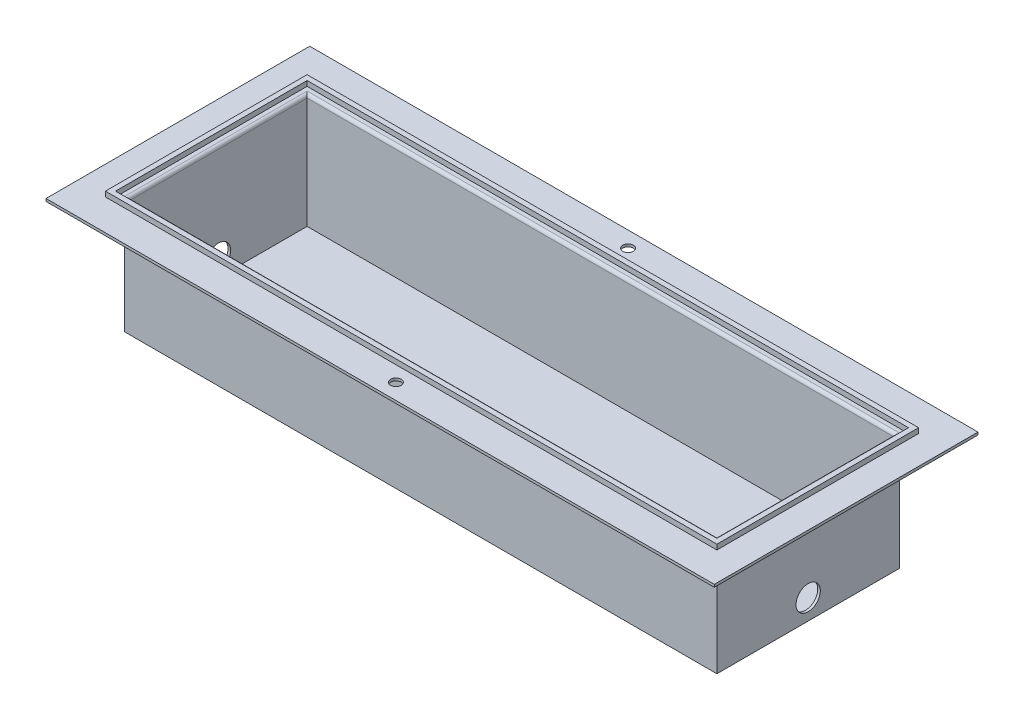
ISO-10303-21;
HEADER;
FILE_DESCRIPTION(('STEP AP214'),'2;1');
FILE_NAME('part.step','',(''),(''),'','','');
FILE_SCHEMA(('AUTOMOTIVE_DESIGN { 1 0 10303 214 1 1 1 1 }'));
ENDSEC;
DATA;
#1=APPLICATION_CONTEXT('core data for automotive mechanical design processes');
#2=APPLICATION_PROTOCOL_DEFINITION('international standard','automotive_design',2000,#1);
#3=PRODUCT_CONTEXT('',#1,'mechanical');
#4=PRODUCT('Part','Part','',(#3));
#5=PRODUCT_RELATED_PRODUCT_CATEGORY('part','',(#4));
#6=PRODUCT_DEFINITION_FORMATION('','',#4);
#7=PRODUCT_DEFINITION_CONTEXT('part definition',#1,'design');
#8=PRODUCT_DEFINITION('design','',#6,#7);
#9=PRODUCT_DEFINITION_SHAPE('','',#8);
#10=(LENGTH_UNIT() NAMED_UNIT(*) SI_UNIT(.MILLI.,.METRE.));
#11=(NAMED_UNIT(*) PLANE_ANGLE_UNIT() SI_UNIT($,.RADIAN.));
#12=(NAMED_UNIT(*) SI_UNIT($,.STERADIAN.) SOLID_ANGLE_UNIT());
#13=UNCERTAINTY_MEASURE_WITH_UNIT(LENGTH_MEASURE(1.E-05),#10,'distance_accuracy_value','');
#14=(GEOMETRIC_REPRESENTATION_CONTEXT(3) GLOBAL_UNCERTAINTY_ASSIGNED_CONTEXT((#13)) GLOBAL_UNIT_ASSIGNED_CONTEXT((#10,
#11,#12)) REPRESENTATION_CONTEXT('',''));
#15=CARTESIAN_POINT('',(0.,0.,0.));
#16=DIRECTION('',(0.,0.,1.));
#17=DIRECTION('',(1.,0.,0.));
#18=AXIS2_PLACEMENT_3D('',#15,#16,#17);
#19=CARTESIAN_POINT('',(0.,73.1012,0.));
#20=DIRECTION('',(0.,-1.,0.));
#21=DIRECTION('',(0.,0.,-1.));
#22=AXIS2_PLACEMENT_3D('',#19,#20,#21);
#23=PLANE('',#22);
#24=CARTESIAN_POINT('',(0.,73.1012,-72.6760583714093));
#25=DIRECTION('',(0.,1.,0.));
#26=DIRECTION('',(0.,0.,1.));
#27=AXIS2_PLACEMENT_3D('',#24,#25,#26);
#28=CIRCLE('',#27,3.324987);
#29=CARTESIAN_POINT('',(0.,73.1012,-69.3510713714093));
#30=VERTEX_POINT('',#29);
#31=EDGE_CURVE('E277',#30,#30,#28,.T.);
#32=ORIENTED_EDGE('',*,*,#31,.F.);
#33=EDGE_LOOP('',(#32));
#34=FACE_BOUND('',#33,.T.);
#35=CARTESIAN_POINT('',(0.,73.1012,72.6760583714093));
#36=DIRECTION('',(0.,1.,0.));
#37=DIRECTION('',(0.,0.,-1.));
#38=AXIS2_PLACEMENT_3D('',#35,#36,#37);
#39=CIRCLE('',#38,3.324987);
#40=CARTESIAN_POINT('',(0.,73.1012,69.3510713714093));
#41=VERTEX_POINT('',#40);
#42=EDGE_CURVE('E270',#41,#41,#39,.T.);
#43=ORIENTED_EDGE('',*,*,#42,.F.);
#44=EDGE_LOOP('',(#43));
#45=FACE_BOUND('',#44,.T.);
#46=DIRECTION('',(-1.,0.,0.));
#47=VECTOR('',#46,1.);
#48=CARTESIAN_POINT('',(191.4144,73.1012,-63.1444));
#49=LINE('',#48,#47);
#50=CARTESIAN_POINT('',(191.4144,73.1012,-63.1444));
#51=VERTEX_POINT('',#50);
#52=CARTESIAN_POINT('',(-191.4144,73.1012,-63.1444));
#53=VERTEX_POINT('',#52);
#54=EDGE_CURVE('E97',#51,#53,#49,.T.);
#55=ORIENTED_EDGE('',*,*,#54,.F.);
#56=DIRECTION('',(0.,0.,1.));
#57=VECTOR('',#56,1.);
#58=CARTESIAN_POINT('',(191.4144,73.1012,-63.1444));
#59=LINE('',#58,#57);
#60=CARTESIAN_POINT('',(191.4144,73.1012,63.1444));
#61=VERTEX_POINT('',#60);
#62=EDGE_CURVE('E290',#51,#61,#59,.T.);
#63=ORIENTED_EDGE('',*,*,#62,.T.);
#64=DIRECTION('',(1.,0.,0.));
#65=VECTOR('',#64,1.);
#66=CARTESIAN_POINT('',(-191.4144,73.1012,63.1444));
#67=LINE('',#66,#65);
#68=CARTESIAN_POINT('',(-191.4144,73.1012,63.1444));
#69=VERTEX_POINT('',#68);
#70=EDGE_CURVE('E282',#69,#61,#67,.T.);
#71=ORIENTED_EDGE('',*,*,#70,.F.);
#72=DIRECTION('',(0.,0.,1.));
#73=VECTOR('',#72,1.);
#74=CARTESIAN_POINT('',(-191.4144,73.1012,-63.1444));
#75=LINE('',#74,#73);
#76=EDGE_CURVE('E102',#53,#69,#75,.T.);
#77=ORIENTED_EDGE('',*,*,#76,.F.);
#78=EDGE_LOOP('',(#55,#63,#71,#77));
#79=FACE_BOUND('',#78,.T.);
#80=DIRECTION('',(0.,0.,1.));
#81=VECTOR('',#80,1.);
#82=CARTESIAN_POINT('',(-209.1944,73.1012,-82.55));
#83=LINE('',#82,#81);
#84=CARTESIAN_POINT('',(-209.1944,73.1012,-82.55));
#85=VERTEX_POINT('',#84);
#86=CARTESIAN_POINT('',(-209.1944,73.1012,82.55));
#87=VERTEX_POINT('',#86);
#88=EDGE_CURVE('E315',#85,#87,#83,.T.);
#89=ORIENTED_EDGE('',*,*,#88,.T.);
#90=DIRECTION('',(1.,0.,0.));
#91=VECTOR('',#90,1.);
#92=CARTESIAN_POINT('',(209.1944,73.1012,82.55));
#93=LINE('',#92,#91);
#94=CARTESIAN_POINT('',(209.1944,73.1012,82.55));
#95=VERTEX_POINT('',#94);
#96=EDGE_CURVE('E318',#87,#95,#93,.T.);
#97=ORIENTED_EDGE('',*,*,#96,.T.);
#98=DIRECTION('',(0.,0.,-1.));
#99=VECTOR('',#98,1.);
#100=CARTESIAN_POINT('',(209.1944,73.1012,-82.55));
#101=LINE('',#100,#99);
#102=CARTESIAN_POINT('',(209.1944,73.1012,-82.55));
#103=VERTEX_POINT('',#102);
#104=EDGE_CURVE('E321',#95,#103,#101,.T.);
#105=ORIENTED_EDGE('',*,*,#104,.T.);
#106=DIRECTION('',(-1.,0.,0.));
#107=VECTOR('',#106,1.);
#108=CARTESIAN_POINT('',(209.1944,73.1012,-82.55));
#109=LINE('',#108,#107);
#110=EDGE_CURVE('E323',#103,#85,#109,.T.);
#111=ORIENTED_EDGE('',*,*,#110,.T.);
#112=EDGE_LOOP('',(#89,#97,#105,#111));
#113=FACE_BOUND('',#112,.T.);
#114=ADVANCED_FACE('F80',(#34,#45,#79,#113),#23,.F.);
#115=CARTESIAN_POINT('',(0.,71.4756,0.));
#116=DIRECTION('',(0.,-1.,0.));
#117=DIRECTION('',(0.,0.,-1.));
#118=AXIS2_PLACEMENT_3D('',#115,#116,#117);
#119=PLANE('',#118);
#120=CARTESIAN_POINT('',(0.,71.4756,-72.6760583714093));
#121=DIRECTION('',(0.,-1.,0.));
#122=DIRECTION('',(0.,0.,-1.));
#123=AXIS2_PLACEMENT_3D('',#120,#121,#122);
#124=CIRCLE('',#123,3.324987);
#125=CARTESIAN_POINT('',(0.,71.4756,-76.0010453714093));
#126=VERTEX_POINT('',#125);
#127=EDGE_CURVE('E1016',#126,#126,#124,.F.);
#128=ORIENTED_EDGE('',*,*,#127,.T.);
#129=EDGE_LOOP('',(#128));
#130=FACE_BOUND('',#129,.T.);
#131=CARTESIAN_POINT('',(0.,71.4756,72.6760583714093));
#132=DIRECTION('',(0.,-1.,0.));
#133=DIRECTION('',(0.,0.,-1.));
#134=AXIS2_PLACEMENT_3D('',#131,#132,#133);
#135=CIRCLE('',#134,3.324987);
#136=CARTESIAN_POINT('',(0.,71.4756,69.3510713714093));
#137=VERTEX_POINT('',#136);
#138=EDGE_CURVE('E1018',#137,#137,#135,.F.);
#139=ORIENTED_EDGE('',*,*,#138,.T.);
#140=EDGE_LOOP('',(#139));
#141=FACE_BOUND('',#140,.T.);
#142=DIRECTION('',(0.,0.,1.));
#143=VECTOR('',#142,1.);
#144=CARTESIAN_POINT('',(-187.325,71.4756,0.));
#145=LINE('',#144,#143);
#146=CARTESIAN_POINT('',(-187.325,71.4756,-59.055));
#147=VERTEX_POINT('',#146);
#148=CARTESIAN_POINT('',(-187.325,71.4756,59.055));
#149=VERTEX_POINT('',#148);
#150=EDGE_CURVE('E404',#147,#149,#145,.T.);
#151=ORIENTED_EDGE('',*,*,#150,.T.);
#152=DIRECTION('',(1.,0.,0.));
#153=VECTOR('',#152,1.);
#154=CARTESIAN_POINT('',(0.,71.4756,59.055));
#155=LINE('',#154,#153);
#156=CARTESIAN_POINT('',(187.325,71.4756,59.0549999999999));
#157=VERTEX_POINT('',#156);
#158=EDGE_CURVE('E410',#149,#157,#155,.T.);
#159=ORIENTED_EDGE('',*,*,#158,.T.);
#160=DIRECTION('',(0.,0.,-1.));
#161=VECTOR('',#160,1.);
#162=CARTESIAN_POINT('',(187.325,71.4756,0.));
#163=LINE('',#162,#161);
#164=CARTESIAN_POINT('',(187.325,71.4756,-59.055));
#165=VERTEX_POINT('',#164);
#166=EDGE_CURVE('E408',#157,#165,#163,.T.);
#167=ORIENTED_EDGE('',*,*,#166,.T.);
#168=DIRECTION('',(-1.,0.,0.));
#169=VECTOR('',#168,1.);
#170=CARTESIAN_POINT('',(0.,71.4756,-59.055));
#171=LINE('',#170,#169);
#172=EDGE_CURVE('E406',#165,#147,#171,.T.);
#173=ORIENTED_EDGE('',*,*,#172,.T.);
#174=EDGE_LOOP('',(#151,#159,#167,#173));
#175=FACE_BOUND('',#174,.T.);
#176=DIRECTION('',(0.,0.,1.));
#177=VECTOR('',#176,1.);
#178=CARTESIAN_POINT('',(-209.1944,71.4756,-82.55));
#179=LINE('',#178,#177);
#180=CARTESIAN_POINT('',(-209.1944,71.4756,-82.55));
#181=VERTEX_POINT('',#180);
#182=CARTESIAN_POINT('',(-209.1944,71.4756,82.55));
#183=VERTEX_POINT('',#182);
#184=EDGE_CURVE('E326',#181,#183,#179,.T.);
#185=ORIENTED_EDGE('',*,*,#184,.F.);
#186=DIRECTION('',(-1.,0.,0.));
#187=VECTOR('',#186,1.);
#188=CARTESIAN_POINT('',(209.1944,71.4756,-82.55));
#189=LINE('',#188,#187);
#190=CARTESIAN_POINT('',(209.1944,71.4756,-82.55));
#191=VERTEX_POINT('',#190);
#192=EDGE_CURVE('E319',#191,#181,#189,.T.);
#193=ORIENTED_EDGE('',*,*,#192,.F.);
#194=DIRECTION('',(0.,0.,-1.));
#195=VECTOR('',#194,1.);
#196=CARTESIAN_POINT('',(209.1944,71.4756,-82.55));
#197=LINE('',#196,#195);
#198=CARTESIAN_POINT('',(209.1944,71.4756,82.55));
#199=VERTEX_POINT('',#198);
#200=EDGE_CURVE('E332',#199,#191,#197,.T.);
#201=ORIENTED_EDGE('',*,*,#200,.F.);
#202=DIRECTION('',(1.,0.,0.));
#203=VECTOR('',#202,1.);
#204=CARTESIAN_POINT('',(209.1944,71.4756,82.55));
#205=LINE('',#204,#203);
#206=EDGE_CURVE('E329',#183,#199,#205,.T.);
#207=ORIENTED_EDGE('',*,*,#206,.F.);
#208=EDGE_LOOP('',(#185,#193,#201,#207));
#209=FACE_BOUND('',#208,.T.);
#210=ADVANCED_FACE('F473',(#130,#141,#175,#209),#119,.T.);
#211=CARTESIAN_POINT('',(-209.1944,73.1012,-82.55));
#212=DIRECTION('',(1.,0.,0.));
#213=DIRECTION('',(0.,0.,-1.));
#214=AXIS2_PLACEMENT_3D('',#211,#212,#213);
#215=PLANE('',#214);
#216=ORIENTED_EDGE('',*,*,#184,.T.);
#217=DIRECTION('',(0.,-1.,0.));
#218=VECTOR('',#217,1.);
#219=CARTESIAN_POINT('',(-209.1944,73.1012,82.55));
#220=LINE('',#219,#218);
#221=EDGE_CURVE('E343',#87,#183,#220,.T.);
#222=ORIENTED_EDGE('',*,*,#221,.F.);
#223=ORIENTED_EDGE('',*,*,#88,.F.);
#224=DIRECTION('',(0.,-1.,0.));
#225=VECTOR('',#224,1.);
#226=CARTESIAN_POINT('',(-209.1944,73.1012,-82.55));
#227=LINE('',#226,#225);
#228=EDGE_CURVE('E325',#85,#181,#227,.T.);
#229=ORIENTED_EDGE('',*,*,#228,.T.);
#230=EDGE_LOOP('',(#216,#222,#223,#229));
#231=FACE_BOUND('',#230,.T.);
#232=ADVANCED_FACE('F476',(#231),#215,.F.);
#233=CARTESIAN_POINT('',(209.1944,73.1012,82.55));
#234=DIRECTION('',(0.,0.,-1.));
#235=DIRECTION('',(-1.,0.,0.));
#236=AXIS2_PLACEMENT_3D('',#233,#234,#235);
#237=PLANE('',#236);
#238=ORIENTED_EDGE('',*,*,#206,.T.);
#239=DIRECTION('',(0.,-1.,0.));
#240=VECTOR('',#239,1.);
#241=CARTESIAN_POINT('',(209.1944,73.1012,82.55));
#242=LINE('',#241,#240);
#243=EDGE_CURVE('E340',#95,#199,#242,.T.);
#244=ORIENTED_EDGE('',*,*,#243,.F.);
#245=ORIENTED_EDGE('',*,*,#96,.F.);
#246=ORIENTED_EDGE('',*,*,#221,.T.);
#247=EDGE_LOOP('',(#238,#244,#245,#246));
#248=FACE_BOUND('',#247,.T.);
#249=ADVANCED_FACE('F495',(#248),#237,.F.);
#250=CARTESIAN_POINT('',(209.1944,73.1012,-82.55));
#251=DIRECTION('',(-1.,0.,0.));
#252=DIRECTION('',(0.,0.,1.));
#253=AXIS2_PLACEMENT_3D('',#250,#251,#252);
#254=PLANE('',#253);
#255=ORIENTED_EDGE('',*,*,#200,.T.);
#256=DIRECTION('',(0.,-1.,0.));
#257=VECTOR('',#256,1.);
#258=CARTESIAN_POINT('',(209.1944,73.1012,-82.55));
#259=LINE('',#258,#257);
#260=EDGE_CURVE('E337',#103,#191,#259,.T.);
#261=ORIENTED_EDGE('',*,*,#260,.F.);
#262=ORIENTED_EDGE('',*,*,#104,.F.);
#263=ORIENTED_EDGE('',*,*,#243,.T.);
#264=EDGE_LOOP('',(#255,#261,#262,#263));
#265=FACE_BOUND('',#264,.T.);
#266=ADVANCED_FACE('F492',(#265),#254,.F.);
#267=CARTESIAN_POINT('',(209.1944,73.1012,-82.55));
#268=DIRECTION('',(0.,0.,1.));
#269=DIRECTION('',(1.,0.,0.));
#270=AXIS2_PLACEMENT_3D('',#267,#268,#269);
#271=PLANE('',#270);
#272=ORIENTED_EDGE('',*,*,#192,.T.);
#273=ORIENTED_EDGE('',*,*,#228,.F.);
#274=ORIENTED_EDGE('',*,*,#110,.F.);
#275=ORIENTED_EDGE('',*,*,#260,.T.);
#276=EDGE_LOOP('',(#272,#273,#274,#275));
#277=FACE_BOUND('',#276,.T.);
#278=ADVANCED_FACE('F488',(#277),#271,.F.);
#279=CARTESIAN_POINT('',(0.,0.,0.));
#280=DIRECTION('',(0.,-1.,0.));
#281=DIRECTION('',(0.,0.,-1.));
#282=AXIS2_PLACEMENT_3D('',#279,#280,#281);
#283=PLANE('',#282);
#284=DIRECTION('',(0.,0.,1.));
#285=VECTOR('',#284,1.);
#286=CARTESIAN_POINT('',(-185.42,0.,-57.15));
#287=LINE('',#286,#285);
#288=CARTESIAN_POINT('',(-185.42,0.,-57.15));
#289=VERTEX_POINT('',#288);
#290=CARTESIAN_POINT('',(-185.42,0.,57.15));
#291=VERTEX_POINT('',#290);
#292=EDGE_CURVE('E366',#289,#291,#287,.T.);
#293=ORIENTED_EDGE('',*,*,#292,.F.);
#294=DIRECTION('',(-1.,0.,0.));
#295=VECTOR('',#294,1.);
#296=CARTESIAN_POINT('',(185.42,0.,-57.15));
#297=LINE('',#296,#295);
#298=CARTESIAN_POINT('',(185.42,0.,-57.15));
#299=VERTEX_POINT('',#298);
#300=EDGE_CURVE('E375',#299,#289,#297,.T.);
#301=ORIENTED_EDGE('',*,*,#300,.F.);
#302=DIRECTION('',(0.,0.,-1.));
#303=VECTOR('',#302,1.);
#304=CARTESIAN_POINT('',(185.42,0.,-57.15));
#305=LINE('',#304,#303);
#306=CARTESIAN_POINT('',(185.42,0.,57.1499999999999));
#307=VERTEX_POINT('',#306);
#308=EDGE_CURVE('E372',#307,#299,#305,.T.);
#309=ORIENTED_EDGE('',*,*,#308,.F.);
#310=DIRECTION('',(1.,0.,0.));
#311=VECTOR('',#310,1.);
#312=CARTESIAN_POINT('',(185.42,0.,57.1499999999999));
#313=LINE('',#312,#311);
#314=EDGE_CURVE('E369',#291,#307,#313,.T.);
#315=ORIENTED_EDGE('',*,*,#314,.F.);
#316=EDGE_LOOP('',(#293,#301,#309,#315));
#317=FACE_BOUND('',#316,.T.);
#318=ADVANCED_FACE('F458',(#317),#283,.T.);
#319=CARTESIAN_POINT('',(185.42,1.6256,-57.15));
#320=DIRECTION('',(-1.,0.,0.));
#321=DIRECTION('',(0.,0.,1.));
#322=AXIS2_PLACEMENT_3D('',#319,#320,#321);
#323=PLANE('',#322);
#324=CARTESIAN_POINT('',(185.42,12.7,0.));
#325=DIRECTION('',(1.,0.,0.));
#326=DIRECTION('',(0.,0.,-1.));
#327=AXIS2_PLACEMENT_3D('',#324,#325,#326);
#328=CIRCLE('',#327,7.62);
#329=CARTESIAN_POINT('',(185.42,12.7,-7.62));
#330=VERTEX_POINT('',#329);
#331=EDGE_CURVE('E1003',#330,#330,#328,.T.);
#332=ORIENTED_EDGE('',*,*,#331,.F.);
#333=EDGE_LOOP('',(#332));
#334=FACE_BOUND('',#333,.T.);
#335=DIRECTION('',(0.,-1.,0.));
#336=VECTOR('',#335,1.);
#337=CARTESIAN_POINT('',(185.42,1.6256,-57.15));
#338=LINE('',#337,#336);
#339=CARTESIAN_POINT('',(185.42,69.5706,-57.15));
#340=VERTEX_POINT('',#339);
#341=EDGE_CURVE('E380',#340,#299,#338,.T.);
#342=ORIENTED_EDGE('',*,*,#341,.F.);
#343=DIRECTION('',(0.,0.,-1.));
#344=VECTOR('',#343,1.);
#345=CARTESIAN_POINT('',(185.42,69.5706,-57.15));
#346=LINE('',#345,#344);
#347=CARTESIAN_POINT('',(185.42,69.5706,57.1499999999999));
#348=VERTEX_POINT('',#347);
#349=EDGE_CURVE('E416',#340,#348,#346,.F.);
#350=ORIENTED_EDGE('',*,*,#349,.T.);
#351=DIRECTION('',(0.,-1.,0.));
#352=VECTOR('',#351,1.);
#353=CARTESIAN_POINT('',(185.42,1.6256,57.1499999999999));
#354=LINE('',#353,#352);
#355=EDGE_CURVE('E382',#348,#307,#354,.T.);
#356=ORIENTED_EDGE('',*,*,#355,.T.);
#357=ORIENTED_EDGE('',*,*,#308,.T.);
#358=EDGE_LOOP('',(#342,#350,#356,#357));
#359=FACE_BOUND('',#358,.T.);
#360=ADVANCED_FACE('F451',(#334,#359),#323,.F.);
#361=CARTESIAN_POINT('',(185.42,1.6256,57.1499999999999));
#362=DIRECTION('',(0.,0.,-1.));
#363=DIRECTION('',(-1.,0.,0.));
#364=AXIS2_PLACEMENT_3D('',#361,#362,#363);
#365=PLANE('',#364);
#366=ORIENTED_EDGE('',*,*,#355,.F.);
#367=DIRECTION('',(1.,0.,0.));
#368=VECTOR('',#367,1.);
#369=CARTESIAN_POINT('',(185.42,69.5706,57.1499999999999));
#370=LINE('',#369,#368);
#371=CARTESIAN_POINT('',(-185.42,69.5706,57.15));
#372=VERTEX_POINT('',#371);
#373=EDGE_CURVE('E413',#348,#372,#370,.F.);
#374=ORIENTED_EDGE('',*,*,#373,.T.);
#375=DIRECTION('',(0.,-1.,0.));
#376=VECTOR('',#375,1.);
#377=CARTESIAN_POINT('',(-185.42,1.6256,57.15));
#378=LINE('',#377,#376);
#379=EDGE_CURVE('E384',#372,#291,#378,.T.);
#380=ORIENTED_EDGE('',*,*,#379,.T.);
#381=ORIENTED_EDGE('',*,*,#314,.T.);
#382=EDGE_LOOP('',(#366,#374,#380,#381));
#383=FACE_BOUND('',#382,.T.);
#384=ADVANCED_FACE('F463',(#383),#365,.F.);
#385=CARTESIAN_POINT('',(-185.42,1.6256,-57.15));
#386=DIRECTION('',(1.,0.,0.));
#387=DIRECTION('',(0.,0.,-1.));
#388=AXIS2_PLACEMENT_3D('',#385,#386,#387);
#389=PLANE('',#388);
#390=CARTESIAN_POINT('',(-185.42,12.7,0.));
#391=DIRECTION('',(1.,0.,0.));
#392=DIRECTION('',(0.,0.,-1.));
#393=AXIS2_PLACEMENT_3D('',#390,#391,#392);
#394=CIRCLE('',#393,7.62);
#395=CARTESIAN_POINT('',(-185.42,12.7,-7.62));
#396=VERTEX_POINT('',#395);
#397=EDGE_CURVE('E1007',#396,#396,#394,.T.);
#398=ORIENTED_EDGE('',*,*,#397,.T.);
#399=EDGE_LOOP('',(#398));
#400=FACE_BOUND('',#399,.T.);
#401=ORIENTED_EDGE('',*,*,#379,.F.);
#402=DIRECTION('',(0.,0.,1.));
#403=VECTOR('',#402,1.);
#404=CARTESIAN_POINT('',(-185.42,69.5706,-57.15));
#405=LINE('',#404,#403);
#406=CARTESIAN_POINT('',(-185.42,69.5706,-57.15));
#407=VERTEX_POINT('',#406);
#408=EDGE_CURVE('E12',#372,#407,#405,.F.);
#409=ORIENTED_EDGE('',*,*,#408,.T.);
#410=DIRECTION('',(0.,-1.,0.));
#411=VECTOR('',#410,1.);
#412=CARTESIAN_POINT('',(-185.42,1.6256,-57.15));
#413=LINE('',#412,#411);
#414=EDGE_CURVE('E378',#407,#289,#413,.T.);
#415=ORIENTED_EDGE('',*,*,#414,.T.);
#416=ORIENTED_EDGE('',*,*,#292,.T.);
#417=EDGE_LOOP('',(#401,#409,#415,#416));
#418=FACE_BOUND('',#417,.T.);
#419=ADVANCED_FACE('F461',(#400,#418),#389,.F.);
#420=CARTESIAN_POINT('',(185.42,1.6256,-57.15));
#421=DIRECTION('',(0.,0.,1.));
#422=DIRECTION('',(1.,0.,0.));
#423=AXIS2_PLACEMENT_3D('',#420,#421,#422);
#424=PLANE('',#423);
#425=ORIENTED_EDGE('',*,*,#414,.F.);
#426=DIRECTION('',(-1.,0.,0.));
#427=VECTOR('',#426,1.);
#428=CARTESIAN_POINT('',(185.42,69.5706,-57.15));
#429=LINE('',#428,#427);
#430=EDGE_CURVE('E89',#407,#340,#429,.F.);
#431=ORIENTED_EDGE('',*,*,#430,.T.);
#432=ORIENTED_EDGE('',*,*,#341,.T.);
#433=ORIENTED_EDGE('',*,*,#300,.T.);
#434=EDGE_LOOP('',(#425,#431,#432,#433));
#435=FACE_BOUND('',#434,.T.);
#436=ADVANCED_FACE('F449',(#435),#424,.F.);
#437=CARTESIAN_POINT('',(0.,69.5706,-59.055));
#438=DIRECTION('',(-1.,0.,0.));
#439=DIRECTION('',(0.,0.,1.));
#440=AXIS2_PLACEMENT_3D('',#437,#438,#439);
#441=CYLINDRICAL_SURFACE('',#440,1.905);
#442=CARTESIAN_POINT('',(187.325,69.5706,-59.055));
#443=DIRECTION('',(-0.707106781186548,0.,-0.707106781186547));
#444=DIRECTION('',(-0.707106781186547,0.,0.707106781186548));
#445=AXIS2_PLACEMENT_3D('',#442,#443,#444);
#446=ELLIPSE('',#445,2.69407683632075,1.905);
#447=EDGE_CURVE('E432',#340,#165,#446,.T.);
#448=ORIENTED_EDGE('',*,*,#447,.F.);
#449=ORIENTED_EDGE('',*,*,#430,.F.);
#450=CARTESIAN_POINT('',(-187.325,69.5706,-59.055));
#451=DIRECTION('',(-0.707106781186547,0.,0.707106781186548));
#452=DIRECTION('',(0.707106781186548,0.,0.707106781186547));
#453=AXIS2_PLACEMENT_3D('',#450,#451,#452);
#454=ELLIPSE('',#453,2.69407683632075,1.905);
#455=EDGE_CURVE('E422',#147,#407,#454,.F.);
#456=ORIENTED_EDGE('',*,*,#455,.F.);
#457=ORIENTED_EDGE('',*,*,#172,.F.);
#458=EDGE_LOOP('',(#448,#449,#456,#457));
#459=FACE_BOUND('',#458,.T.);
#460=ADVANCED_FACE('F82',(#459),#441,.F.);
#461=CARTESIAN_POINT('',(-187.325,69.5706,0.));
#462=DIRECTION('',(0.,0.,1.));
#463=DIRECTION('',(1.,0.,0.));
#464=AXIS2_PLACEMENT_3D('',#461,#462,#463);
#465=CYLINDRICAL_SURFACE('',#464,1.905);
#466=ORIENTED_EDGE('',*,*,#455,.T.);
#467=ORIENTED_EDGE('',*,*,#408,.F.);
#468=CARTESIAN_POINT('',(-187.325,69.5706,59.055));
#469=DIRECTION('',(0.707106781186548,0.,0.707106781186547));
#470=DIRECTION('',(-0.707106781186547,0.,0.707106781186548));
#471=AXIS2_PLACEMENT_3D('',#468,#469,#470);
#472=ELLIPSE('',#471,2.69407683632075,1.905);
#473=EDGE_CURVE('E430',#149,#372,#472,.F.);
#474=ORIENTED_EDGE('',*,*,#473,.F.);
#475=ORIENTED_EDGE('',*,*,#150,.F.);
#476=EDGE_LOOP('',(#466,#467,#474,#475));
#477=FACE_BOUND('',#476,.T.);
#478=ADVANCED_FACE('F439',(#477),#465,.F.);
#479=CARTESIAN_POINT('',(187.325,69.5706,0.));
#480=DIRECTION('',(0.,0.,-1.));
#481=DIRECTION('',(-1.,0.,0.));
#482=AXIS2_PLACEMENT_3D('',#479,#480,#481);
#483=CYLINDRICAL_SURFACE('',#482,1.905);
#484=ORIENTED_EDGE('',*,*,#447,.T.);
#485=ORIENTED_EDGE('',*,*,#166,.F.);
#486=CARTESIAN_POINT('',(187.325,69.5706,59.0549999999999));
#487=DIRECTION('',(0.707106781186547,0.,-0.707106781186548));
#488=DIRECTION('',(-0.707106781186548,0.,-0.707106781186547));
#489=AXIS2_PLACEMENT_3D('',#486,#487,#488);
#490=ELLIPSE('',#489,2.69407683632075,1.905);
#491=EDGE_CURVE('E307',#348,#157,#490,.T.);
#492=ORIENTED_EDGE('',*,*,#491,.F.);
#493=ORIENTED_EDGE('',*,*,#349,.F.);
#494=EDGE_LOOP('',(#484,#485,#492,#493));
#495=FACE_BOUND('',#494,.T.);
#496=ADVANCED_FACE('F471',(#495),#483,.F.);
#497=CARTESIAN_POINT('',(0.,69.5706,59.055));
#498=DIRECTION('',(1.,0.,0.));
#499=DIRECTION('',(0.,0.,-1.));
#500=AXIS2_PLACEMENT_3D('',#497,#498,#499);
#501=CYLINDRICAL_SURFACE('',#500,1.905);
#502=ORIENTED_EDGE('',*,*,#473,.T.);
#503=ORIENTED_EDGE('',*,*,#373,.F.);
#504=ORIENTED_EDGE('',*,*,#491,.T.);
#505=ORIENTED_EDGE('',*,*,#158,.F.);
#506=EDGE_LOOP('',(#502,#503,#504,#505));
#507=FACE_BOUND('',#506,.T.);
#508=ADVANCED_FACE('F467',(#507),#501,.F.);
#509=CARTESIAN_POINT('',(191.4144,76.2762,-63.1444));
#510=DIRECTION('',(1.,0.,0.));
#511=DIRECTION('',(0.,0.,-1.));
#512=AXIS2_PLACEMENT_3D('',#509,#510,#511);
#513=PLANE('',#512);
#514=ORIENTED_EDGE('',*,*,#62,.F.);
#515=DIRECTION('',(0.,-1.,0.));
#516=VECTOR('',#515,1.);
#517=CARTESIAN_POINT('',(191.4144,76.2762,-63.1444));
#518=LINE('',#517,#516);
#519=CARTESIAN_POINT('',(191.4144,76.2762,-63.1444));
#520=VERTEX_POINT('',#519);
#521=EDGE_CURVE('E308',#520,#51,#518,.T.);
#522=ORIENTED_EDGE('',*,*,#521,.F.);
#523=DIRECTION('',(0.,0.,1.));
#524=VECTOR('',#523,1.);
#525=CARTESIAN_POINT('',(191.4144,76.2762,-63.1444));
#526=LINE('',#525,#524);
#527=CARTESIAN_POINT('',(191.4144,76.2762,63.1444));
#528=VERTEX_POINT('',#527);
#529=EDGE_CURVE('E295',#520,#528,#526,.T.);
#530=ORIENTED_EDGE('',*,*,#529,.T.);
#531=DIRECTION('',(0.,-1.,0.));
#532=VECTOR('',#531,1.);
#533=CARTESIAN_POINT('',(191.4144,76.2762,63.1444));
#534=LINE('',#533,#532);
#535=EDGE_CURVE('E304',#528,#61,#534,.T.);
#536=ORIENTED_EDGE('',*,*,#535,.T.);
#537=EDGE_LOOP('',(#514,#522,#530,#536));
#538=FACE_BOUND('',#537,.T.);
#539=ADVANCED_FACE('F545',(#538),#513,.T.);
#540=CARTESIAN_POINT('',(191.4144,76.2762,-63.1444));
#541=DIRECTION('',(0.,0.,1.));
#542=DIRECTION('',(1.,0.,0.));
#543=AXIS2_PLACEMENT_3D('',#540,#541,#542);
#544=PLANE('',#543);
#545=ORIENTED_EDGE('',*,*,#54,.T.);
#546=DIRECTION('',(0.,-1.,0.));
#547=VECTOR('',#546,1.);
#548=CARTESIAN_POINT('',(-191.4144,76.2762,-63.1444));
#549=LINE('',#548,#547);
#550=CARTESIAN_POINT('',(-191.4144,76.2762,-63.1444));
#551=VERTEX_POINT('',#550);
#552=EDGE_CURVE('E310',#551,#53,#549,.T.);
#553=ORIENTED_EDGE('',*,*,#552,.F.);
#554=DIRECTION('',(1.,0.,0.));
#555=VECTOR('',#554,1.);
#556=CARTESIAN_POINT('',(-191.4144,76.2762,-63.1444));
#557=LINE('',#556,#555);
#558=EDGE_CURVE('E293',#551,#520,#557,.T.);
#559=ORIENTED_EDGE('',*,*,#558,.T.);
#560=ORIENTED_EDGE('',*,*,#521,.T.);
#561=EDGE_LOOP('',(#545,#553,#559,#560));
#562=FACE_BOUND('',#561,.T.);
#563=ADVANCED_FACE('F548',(#562),#544,.F.);
#564=CARTESIAN_POINT('',(-191.4144,76.2762,-63.1444));
#565=DIRECTION('',(1.,0.,0.));
#566=DIRECTION('',(0.,0.,-1.));
#567=AXIS2_PLACEMENT_3D('',#564,#565,#566);
#568=PLANE('',#567);
#569=ORIENTED_EDGE('',*,*,#76,.T.);
#570=DIRECTION('',(0.,-1.,0.));
#571=VECTOR('',#570,1.);
#572=CARTESIAN_POINT('',(-191.4144,76.2762,63.1444));
#573=LINE('',#572,#571);
#574=CARTESIAN_POINT('',(-191.4144,76.2762,63.1444));
#575=VERTEX_POINT('',#574);
#576=EDGE_CURVE('E298',#575,#69,#573,.T.);
#577=ORIENTED_EDGE('',*,*,#576,.F.);
#578=DIRECTION('',(0.,0.,1.));
#579=VECTOR('',#578,1.);
#580=CARTESIAN_POINT('',(-191.4144,76.2762,-63.1444));
#581=LINE('',#580,#579);
#582=EDGE_CURVE('E289',#551,#575,#581,.T.);
#583=ORIENTED_EDGE('',*,*,#582,.F.);
#584=ORIENTED_EDGE('',*,*,#552,.T.);
#585=EDGE_LOOP('',(#569,#577,#583,#584));
#586=FACE_BOUND('',#585,.T.);
#587=ADVANCED_FACE('F552',(#586),#568,.F.);
#588=CARTESIAN_POINT('',(-191.4144,76.2762,63.1444));
#589=DIRECTION('',(0.,0.,-1.));
#590=DIRECTION('',(-1.,0.,0.));
#591=AXIS2_PLACEMENT_3D('',#588,#589,#590);
#592=PLANE('',#591);
#593=ORIENTED_EDGE('',*,*,#70,.T.);
#594=ORIENTED_EDGE('',*,*,#535,.F.);
#595=DIRECTION('',(-1.,0.,0.));
#596=VECTOR('',#595,1.);
#597=CARTESIAN_POINT('',(191.4144,76.2762,63.1444));
#598=LINE('',#597,#596);
#599=EDGE_CURVE('E287',#528,#575,#598,.T.);
#600=ORIENTED_EDGE('',*,*,#599,.T.);
#601=ORIENTED_EDGE('',*,*,#576,.T.);
#602=EDGE_LOOP('',(#593,#594,#600,#601));
#603=FACE_BOUND('',#602,.T.);
#604=ADVANCED_FACE('F544',(#603),#592,.F.);
#605=CARTESIAN_POINT('',(0.,76.2762,0.));
#606=DIRECTION('',(0.,1.,0.));
#607=DIRECTION('',(0.,0.,1.));
#608=AXIS2_PLACEMENT_3D('',#605,#606,#607);
#609=PLANE('',#608);
#610=DIRECTION('',(0.,0.,1.));
#611=VECTOR('',#610,1.);
#612=CARTESIAN_POINT('',(188.2394,76.2762,-59.9694));
#613=LINE('',#612,#611);
#614=CARTESIAN_POINT('',(188.2394,76.2762,-59.9694));
#615=VERTEX_POINT('',#614);
#616=CARTESIAN_POINT('',(188.2394,76.2762,59.9694));
#617=VERTEX_POINT('',#616);
#618=EDGE_CURVE('E246',#615,#617,#613,.T.);
#619=ORIENTED_EDGE('',*,*,#618,.T.);
#620=DIRECTION('',(-1.,0.,0.));
#621=VECTOR('',#620,1.);
#622=CARTESIAN_POINT('',(188.2394,76.2762,59.9694));
#623=LINE('',#622,#621);
#624=CARTESIAN_POINT('',(-188.2394,76.2762,59.9694));
#625=VERTEX_POINT('',#624);
#626=EDGE_CURVE('E255',#617,#625,#623,.T.);
#627=ORIENTED_EDGE('',*,*,#626,.T.);
#628=DIRECTION('',(0.,0.,1.));
#629=VECTOR('',#628,1.);
#630=CARTESIAN_POINT('',(-188.2394,76.2762,-59.9694));
#631=LINE('',#630,#629);
#632=CARTESIAN_POINT('',(-188.2394,76.2762,-59.9694));
#633=VERTEX_POINT('',#632);
#634=EDGE_CURVE('E261',#633,#625,#631,.T.);
#635=ORIENTED_EDGE('',*,*,#634,.F.);
#636=DIRECTION('',(-1.,0.,0.));
#637=VECTOR('',#636,1.);
#638=CARTESIAN_POINT('',(188.2394,76.2762,-59.9694));
#639=LINE('',#638,#637);
#640=EDGE_CURVE('E252',#615,#633,#639,.T.);
#641=ORIENTED_EDGE('',*,*,#640,.F.);
#642=EDGE_LOOP('',(#619,#627,#635,#641));
#643=FACE_BOUND('',#642,.T.);
#644=ORIENTED_EDGE('',*,*,#599,.F.);
#645=ORIENTED_EDGE('',*,*,#529,.F.);
#646=ORIENTED_EDGE('',*,*,#558,.F.);
#647=ORIENTED_EDGE('',*,*,#582,.T.);
#648=EDGE_LOOP('',(#644,#645,#646,#647));
#649=FACE_BOUND('',#648,.T.);
#650=ADVANCED_FACE('F263',(#643,#649),#609,.T.);
#651=CARTESIAN_POINT('',(188.2394,76.2762,-59.9694));
#652=DIRECTION('',(1.,0.,0.));
#653=DIRECTION('',(0.,0.,-1.));
#654=AXIS2_PLACEMENT_3D('',#651,#652,#653);
#655=PLANE('',#654);
#656=DIRECTION('',(0.,0.,1.));
#657=VECTOR('',#656,1.);
#658=CARTESIAN_POINT('',(188.2394,73.1012,-59.9694));
#659=LINE('',#658,#657);
#660=CARTESIAN_POINT('',(188.2394,73.1012,-59.9694));
#661=VERTEX_POINT('',#660);
#662=CARTESIAN_POINT('',(188.2394,73.1012,59.9694));
#663=VERTEX_POINT('',#662);
#664=EDGE_CURVE('E248',#661,#663,#659,.T.);
#665=ORIENTED_EDGE('',*,*,#664,.T.);
#666=DIRECTION('',(0.,-1.,0.));
#667=VECTOR('',#666,1.);
#668=CARTESIAN_POINT('',(188.2394,76.2762,59.9694));
#669=LINE('',#668,#667);
#670=EDGE_CURVE('E241',#617,#663,#669,.T.);
#671=ORIENTED_EDGE('',*,*,#670,.F.);
#672=ORIENTED_EDGE('',*,*,#618,.F.);
#673=DIRECTION('',(0.,-1.,0.));
#674=VECTOR('',#673,1.);
#675=CARTESIAN_POINT('',(188.2394,76.2762,-59.9694));
#676=LINE('',#675,#674);
#677=EDGE_CURVE('E280',#615,#661,#676,.T.);
#678=ORIENTED_EDGE('',*,*,#677,.T.);
#679=EDGE_LOOP('',(#665,#671,#672,#678));
#680=FACE_BOUND('',#679,.T.);
#681=ADVANCED_FACE('F243',(#680),#655,.F.);
#682=CARTESIAN_POINT('',(188.2394,76.2762,-59.9694));
#683=DIRECTION('',(0.,0.,1.));
#684=DIRECTION('',(1.,0.,0.));
#685=AXIS2_PLACEMENT_3D('',#682,#683,#684);
#686=PLANE('',#685);
#687=DIRECTION('',(-1.,0.,0.));
#688=VECTOR('',#687,1.);
#689=CARTESIAN_POINT('',(188.2394,73.1012,-59.9694));
#690=LINE('',#689,#688);
#691=CARTESIAN_POINT('',(-188.2394,73.1012,-59.9694));
#692=VERTEX_POINT('',#691);
#693=EDGE_CURVE('E265',#661,#692,#690,.T.);
#694=ORIENTED_EDGE('',*,*,#693,.F.);
#695=ORIENTED_EDGE('',*,*,#677,.F.);
#696=ORIENTED_EDGE('',*,*,#640,.T.);
#697=DIRECTION('',(0.,-1.,0.));
#698=VECTOR('',#697,1.);
#699=CARTESIAN_POINT('',(-188.2394,76.2762,-59.9694));
#700=LINE('',#699,#698);
#701=EDGE_CURVE('E283',#633,#692,#700,.T.);
#702=ORIENTED_EDGE('',*,*,#701,.T.);
#703=EDGE_LOOP('',(#694,#695,#696,#702));
#704=FACE_BOUND('',#703,.T.);
#705=ADVANCED_FACE('F525',(#704),#686,.T.);
#706=CARTESIAN_POINT('',(-188.2394,76.2762,-59.9694));
#707=DIRECTION('',(1.,0.,0.));
#708=DIRECTION('',(0.,0.,-1.));
#709=AXIS2_PLACEMENT_3D('',#706,#707,#708);
#710=PLANE('',#709);
#711=DIRECTION('',(0.,0.,1.));
#712=VECTOR('',#711,1.);
#713=CARTESIAN_POINT('',(-188.2394,73.1012,-59.9694));
#714=LINE('',#713,#712);
#715=CARTESIAN_POINT('',(-188.2394,73.1012,59.9694));
#716=VERTEX_POINT('',#715);
#717=EDGE_CURVE('E267',#692,#716,#714,.T.);
#718=ORIENTED_EDGE('',*,*,#717,.F.);
#719=ORIENTED_EDGE('',*,*,#701,.F.);
#720=ORIENTED_EDGE('',*,*,#634,.T.);
#721=DIRECTION('',(0.,-1.,0.));
#722=VECTOR('',#721,1.);
#723=CARTESIAN_POINT('',(-188.2394,76.2762,59.9694));
#724=LINE('',#723,#722);
#725=EDGE_CURVE('E251',#625,#716,#724,.T.);
#726=ORIENTED_EDGE('',*,*,#725,.T.);
#727=EDGE_LOOP('',(#718,#719,#720,#726));
#728=FACE_BOUND('',#727,.T.);
#729=ADVANCED_FACE('F529',(#728),#710,.T.);
#730=CARTESIAN_POINT('',(188.2394,76.2762,59.9694));
#731=DIRECTION('',(0.,0.,1.));
#732=DIRECTION('',(1.,0.,0.));
#733=AXIS2_PLACEMENT_3D('',#730,#731,#732);
#734=PLANE('',#733);
#735=DIRECTION('',(-1.,0.,0.));
#736=VECTOR('',#735,1.);
#737=CARTESIAN_POINT('',(188.2394,73.1012,59.9694));
#738=LINE('',#737,#736);
#739=EDGE_CURVE('E276',#663,#716,#738,.T.);
#740=ORIENTED_EDGE('',*,*,#739,.T.);
#741=ORIENTED_EDGE('',*,*,#725,.F.);
#742=ORIENTED_EDGE('',*,*,#626,.F.);
#743=ORIENTED_EDGE('',*,*,#670,.T.);
#744=EDGE_LOOP('',(#740,#741,#742,#743));
#745=FACE_BOUND('',#744,.T.);
#746=ADVANCED_FACE('F256',(#745),#734,.F.);
#747=CARTESIAN_POINT('',(0.,1.6256,0.));
#748=DIRECTION('',(0.,-1.,0.));
#749=DIRECTION('',(0.,0.,-1.));
#750=AXIS2_PLACEMENT_3D('',#747,#748,#749);
#751=PLANE('',#750);
#752=DIRECTION('',(-1.,0.,0.));
#753=VECTOR('',#752,1.);
#754=CARTESIAN_POINT('',(0.,1.6256,-55.5244));
#755=LINE('',#754,#753);
#756=CARTESIAN_POINT('',(183.7944,1.6256,-55.5244));
#757=VERTEX_POINT('',#756);
#758=CARTESIAN_POINT('',(-183.7944,1.6256,-55.5244));
#759=VERTEX_POINT('',#758);
#760=EDGE_CURVE('E349',#757,#759,#755,.T.);
#761=ORIENTED_EDGE('',*,*,#760,.T.);
#762=DIRECTION('',(0.,0.,1.));
#763=VECTOR('',#762,1.);
#764=CARTESIAN_POINT('',(-183.7944,1.6256,0.));
#765=LINE('',#764,#763);
#766=CARTESIAN_POINT('',(-183.7944,1.6256,55.5244));
#767=VERTEX_POINT('',#766);
#768=EDGE_CURVE('E346',#759,#767,#765,.T.);
#769=ORIENTED_EDGE('',*,*,#768,.T.);
#770=DIRECTION('',(-1.,0.,0.));
#771=VECTOR('',#770,1.);
#772=CARTESIAN_POINT('',(0.,1.6256,55.5244));
#773=LINE('',#772,#771);
#774=CARTESIAN_POINT('',(183.7944,1.6256,55.5244));
#775=VERTEX_POINT('',#774);
#776=EDGE_CURVE('E355',#775,#767,#773,.T.);
#777=ORIENTED_EDGE('',*,*,#776,.F.);
#778=DIRECTION('',(0.,0.,1.));
#779=VECTOR('',#778,1.);
#780=CARTESIAN_POINT('',(183.7944,1.6256,0.));
#781=LINE('',#780,#779);
#782=EDGE_CURVE('E352',#757,#775,#781,.T.);
#783=ORIENTED_EDGE('',*,*,#782,.F.);
#784=EDGE_LOOP('',(#761,#769,#777,#783));
#785=FACE_BOUND('',#784,.T.);
#786=ADVANCED_FACE('F536',(#785),#751,.F.);
#787=CARTESIAN_POINT('',(183.7944,71.4756,0.));
#788=DIRECTION('',(1.,0.,0.));
#789=DIRECTION('',(0.,0.,-1.));
#790=AXIS2_PLACEMENT_3D('',#787,#788,#789);
#791=PLANE('',#790);
#792=CARTESIAN_POINT('',(183.7944,12.7,0.));
#793=DIRECTION('',(1.,0.,0.));
#794=DIRECTION('',(0.,0.,-1.));
#795=AXIS2_PLACEMENT_3D('',#792,#793,#794);
#796=CIRCLE('',#795,7.62);
#797=CARTESIAN_POINT('',(183.7944,12.7,-7.62));
#798=VERTEX_POINT('',#797);
#799=EDGE_CURVE('E1006',#798,#798,#796,.T.);
#800=ORIENTED_EDGE('',*,*,#799,.T.);
#801=EDGE_LOOP('',(#800));
#802=FACE_BOUND('',#801,.T.);
#803=DIRECTION('',(0.,-1.,0.));
#804=VECTOR('',#803,1.);
#805=CARTESIAN_POINT('',(183.7944,71.4756,55.5244));
#806=LINE('',#805,#804);
#807=CARTESIAN_POINT('',(183.7944,71.1962,55.5244));
#808=VERTEX_POINT('',#807);
#809=EDGE_CURVE('E360',#808,#775,#806,.T.);
#810=ORIENTED_EDGE('',*,*,#809,.F.);
#811=DIRECTION('',(0.,0.,-1.));
#812=VECTOR('',#811,1.);
#813=CARTESIAN_POINT('',(183.7944,71.1962,0.));
#814=LINE('',#813,#812);
#815=CARTESIAN_POINT('',(183.7944,71.1962,-55.5244));
#816=VERTEX_POINT('',#815);
#817=EDGE_CURVE('E400',#808,#816,#814,.T.);
#818=ORIENTED_EDGE('',*,*,#817,.T.);
#819=DIRECTION('',(0.,-1.,0.));
#820=VECTOR('',#819,1.);
#821=CARTESIAN_POINT('',(183.7944,71.4756,-55.5244));
#822=LINE('',#821,#820);
#823=EDGE_CURVE('E362',#816,#757,#822,.T.);
#824=ORIENTED_EDGE('',*,*,#823,.T.);
#825=ORIENTED_EDGE('',*,*,#782,.T.);
#826=EDGE_LOOP('',(#810,#818,#824,#825));
#827=FACE_BOUND('',#826,.T.);
#828=ADVANCED_FACE('F658',(#802,#827),#791,.F.);
#829=CARTESIAN_POINT('',(0.,71.4756,-55.5244));
#830=DIRECTION('',(0.,0.,1.));
#831=DIRECTION('',(1.,0.,0.));
#832=AXIS2_PLACEMENT_3D('',#829,#830,#831);
#833=PLANE('',#832);
#834=ORIENTED_EDGE('',*,*,#823,.F.);
#835=DIRECTION('',(-1.,0.,0.));
#836=VECTOR('',#835,1.);
#837=CARTESIAN_POINT('',(-183.7944,71.1962,-55.5244));
#838=LINE('',#837,#836);
#839=CARTESIAN_POINT('',(-183.7944,71.1962,-55.5244));
#840=VERTEX_POINT('',#839);
#841=EDGE_CURVE('E398',#816,#840,#838,.T.);
#842=ORIENTED_EDGE('',*,*,#841,.T.);
#843=DIRECTION('',(0.,-1.,0.));
#844=VECTOR('',#843,1.);
#845=CARTESIAN_POINT('',(-183.7944,71.4756,-55.5244));
#846=LINE('',#845,#844);
#847=EDGE_CURVE('E364',#840,#759,#846,.T.);
#848=ORIENTED_EDGE('',*,*,#847,.T.);
#849=ORIENTED_EDGE('',*,*,#760,.F.);
#850=EDGE_LOOP('',(#834,#842,#848,#849));
#851=FACE_BOUND('',#850,.T.);
#852=ADVANCED_FACE('F662',(#851),#833,.T.);
#853=CARTESIAN_POINT('',(-183.7944,71.4756,0.));
#854=DIRECTION('',(1.,0.,0.));
#855=DIRECTION('',(0.,0.,-1.));
#856=AXIS2_PLACEMENT_3D('',#853,#854,#855);
#857=PLANE('',#856);
#858=CARTESIAN_POINT('',(-183.7944,12.7,0.));
#859=DIRECTION('',(1.,0.,0.));
#860=DIRECTION('',(0.,0.,-1.));
#861=AXIS2_PLACEMENT_3D('',#858,#859,#860);
#862=CIRCLE('',#861,7.62);
#863=CARTESIAN_POINT('',(-183.7944,12.7,-7.62));
#864=VERTEX_POINT('',#863);
#865=EDGE_CURVE('E84',#864,#864,#862,.T.);
#866=ORIENTED_EDGE('',*,*,#865,.F.);
#867=EDGE_LOOP('',(#866));
#868=FACE_BOUND('',#867,.T.);
#869=ORIENTED_EDGE('',*,*,#847,.F.);
#870=DIRECTION('',(0.,0.,1.));
#871=VECTOR('',#870,1.);
#872=CARTESIAN_POINT('',(-183.7944,71.1962,55.5244));
#873=LINE('',#872,#871);
#874=CARTESIAN_POINT('',(-183.7944,71.1962,55.5244));
#875=VERTEX_POINT('',#874);
#876=EDGE_CURVE('E386',#840,#875,#873,.T.);
#877=ORIENTED_EDGE('',*,*,#876,.T.);
#878=DIRECTION('',(0.,-1.,0.));
#879=VECTOR('',#878,1.);
#880=CARTESIAN_POINT('',(-183.7944,71.4756,55.5244));
#881=LINE('',#880,#879);
#882=EDGE_CURVE('E358',#875,#767,#881,.T.);
#883=ORIENTED_EDGE('',*,*,#882,.T.);
#884=ORIENTED_EDGE('',*,*,#768,.F.);
#885=EDGE_LOOP('',(#869,#877,#883,#884));
#886=FACE_BOUND('',#885,.T.);
#887=ADVANCED_FACE('F668',(#868,#886),#857,.T.);
#888=CARTESIAN_POINT('',(0.,71.4756,55.5244));
#889=DIRECTION('',(0.,0.,1.));
#890=DIRECTION('',(1.,0.,0.));
#891=AXIS2_PLACEMENT_3D('',#888,#889,#890);
#892=PLANE('',#891);
#893=ORIENTED_EDGE('',*,*,#882,.F.);
#894=DIRECTION('',(1.,0.,0.));
#895=VECTOR('',#894,1.);
#896=CARTESIAN_POINT('',(0.,71.1962,55.5244));
#897=LINE('',#896,#895);
#898=EDGE_CURVE('E402',#875,#808,#897,.T.);
#899=ORIENTED_EDGE('',*,*,#898,.T.);
#900=ORIENTED_EDGE('',*,*,#809,.T.);
#901=ORIENTED_EDGE('',*,*,#776,.T.);
#902=EDGE_LOOP('',(#893,#899,#900,#901));
#903=FACE_BOUND('',#902,.T.);
#904=ADVANCED_FACE('F672',(#903),#892,.F.);
#905=CARTESIAN_POINT('',(185.6994,71.1962,0.));
#906=DIRECTION('',(0.,0.,-1.));
#907=DIRECTION('',(-1.,0.,0.));
#908=AXIS2_PLACEMENT_3D('',#905,#906,#907);
#909=CYLINDRICAL_SURFACE('',#908,1.905);
#910=CARTESIAN_POINT('',(185.6994,71.1962,57.4294));
#911=DIRECTION('',(0.707106781186547,0.,-0.707106781186547));
#912=DIRECTION('',(-0.707106781186547,0.,-0.707106781186547));
#913=AXIS2_PLACEMENT_3D('',#910,#911,#912);
#914=ELLIPSE('',#913,2.69407683632075,1.905);
#915=CARTESIAN_POINT('',(185.6994,73.1012,57.4294));
#916=VERTEX_POINT('',#915);
#917=EDGE_CURVE('E424',#916,#808,#914,.F.);
#918=ORIENTED_EDGE('',*,*,#917,.F.);
#919=DIRECTION('',(0.,0.,-1.));
#920=VECTOR('',#919,1.);
#921=CARTESIAN_POINT('',(185.6994,73.1012,0.));
#922=LINE('',#921,#920);
#923=CARTESIAN_POINT('',(185.6994,73.1012,-57.4294));
#924=VERTEX_POINT('',#923);
#925=EDGE_CURVE('E391',#924,#916,#922,.F.);
#926=ORIENTED_EDGE('',*,*,#925,.F.);
#927=CARTESIAN_POINT('',(185.6994,71.1962,-57.4294));
#928=DIRECTION('',(0.707106781186547,0.,0.707106781186547));
#929=DIRECTION('',(0.707106781186547,0.,-0.707106781186547));
#930=AXIS2_PLACEMENT_3D('',#927,#928,#929);
#931=ELLIPSE('',#930,2.69407683632075,1.905);
#932=EDGE_CURVE('E330',#816,#924,#931,.F.);
#933=ORIENTED_EDGE('',*,*,#932,.F.);
#934=ORIENTED_EDGE('',*,*,#817,.F.);
#935=EDGE_LOOP('',(#918,#926,#933,#934));
#936=FACE_BOUND('',#935,.T.);
#937=ADVANCED_FACE('F795',(#936),#909,.T.);
#938=CARTESIAN_POINT('',(0.,71.1962,-57.4294));
#939=DIRECTION('',(1.,0.,0.));
#940=DIRECTION('',(0.,0.,-1.));
#941=AXIS2_PLACEMENT_3D('',#938,#939,#940);
#942=CYLINDRICAL_SURFACE('',#941,1.905);
#943=ORIENTED_EDGE('',*,*,#932,.T.);
#944=DIRECTION('',(-1.,0.,0.));
#945=VECTOR('',#944,1.);
#946=CARTESIAN_POINT('',(183.7944,73.1012,-57.4294));
#947=LINE('',#946,#945);
#948=CARTESIAN_POINT('',(-185.6994,73.1012,-57.4294));
#949=VERTEX_POINT('',#948);
#950=EDGE_CURVE('E393',#949,#924,#947,.F.);
#951=ORIENTED_EDGE('',*,*,#950,.F.);
#952=CARTESIAN_POINT('',(-185.6994,71.1962,-57.4294));
#953=DIRECTION('',(0.707106781186547,0.,-0.707106781186547));
#954=DIRECTION('',(-0.707106781186547,0.,-0.707106781186547));
#955=AXIS2_PLACEMENT_3D('',#952,#953,#954);
#956=ELLIPSE('',#955,2.69407683632075,1.905);
#957=EDGE_CURVE('E421',#840,#949,#956,.F.);
#958=ORIENTED_EDGE('',*,*,#957,.F.);
#959=ORIENTED_EDGE('',*,*,#841,.F.);
#960=EDGE_LOOP('',(#943,#951,#958,#959));
#961=FACE_BOUND('',#960,.T.);
#962=ADVANCED_FACE('F777',(#961),#942,.T.);
#963=CARTESIAN_POINT('',(-185.6994,71.1962,0.));
#964=DIRECTION('',(0.,0.,-1.));
#965=DIRECTION('',(-1.,0.,0.));
#966=AXIS2_PLACEMENT_3D('',#963,#964,#965);
#967=CYLINDRICAL_SURFACE('',#966,1.905);
#968=ORIENTED_EDGE('',*,*,#957,.T.);
#969=DIRECTION('',(0.,0.,1.));
#970=VECTOR('',#969,1.);
#971=CARTESIAN_POINT('',(-185.6994,73.1012,-55.5244));
#972=LINE('',#971,#970);
#973=CARTESIAN_POINT('',(-185.6994,73.1012,57.4294));
#974=VERTEX_POINT('',#973);
#975=EDGE_CURVE('E395',#974,#949,#972,.F.);
#976=ORIENTED_EDGE('',*,*,#975,.F.);
#977=CARTESIAN_POINT('',(-185.6994,71.1962,57.4294));
#978=DIRECTION('',(-0.707106781186547,0.,-0.707106781186547));
#979=DIRECTION('',(0.707106781186547,0.,-0.707106781186547));
#980=AXIS2_PLACEMENT_3D('',#977,#978,#979);
#981=ELLIPSE('',#980,2.69407683632075,1.905);
#982=EDGE_CURVE('E419',#974,#875,#981,.T.);
#983=ORIENTED_EDGE('',*,*,#982,.T.);
#984=ORIENTED_EDGE('',*,*,#876,.F.);
#985=EDGE_LOOP('',(#968,#976,#983,#984));
#986=FACE_BOUND('',#985,.T.);
#987=ADVANCED_FACE('F517',(#986),#967,.T.);
#988=CARTESIAN_POINT('',(0.,71.1962,57.4294));
#989=DIRECTION('',(1.,0.,0.));
#990=DIRECTION('',(0.,0.,-1.));
#991=AXIS2_PLACEMENT_3D('',#988,#989,#990);
#992=CYLINDRICAL_SURFACE('',#991,1.905);
#993=ORIENTED_EDGE('',*,*,#917,.T.);
#994=ORIENTED_EDGE('',*,*,#898,.F.);
#995=ORIENTED_EDGE('',*,*,#982,.F.);
#996=DIRECTION('',(1.,0.,0.));
#997=VECTOR('',#996,1.);
#998=CARTESIAN_POINT('',(0.,73.1012,57.4294));
#999=LINE('',#998,#997);
#1000=EDGE_CURVE('E389',#916,#974,#999,.F.);
#1001=ORIENTED_EDGE('',*,*,#1000,.F.);
#1002=EDGE_LOOP('',(#993,#994,#995,#1001));
#1003=FACE_BOUND('',#1002,.T.);
#1004=ADVANCED_FACE('F508',(#1003),#992,.T.);
#1005=ORIENTED_EDGE('',*,*,#1000,.T.);
#1006=ORIENTED_EDGE('',*,*,#975,.T.);
#1007=ORIENTED_EDGE('',*,*,#950,.T.);
#1008=ORIENTED_EDGE('',*,*,#925,.T.);
#1009=EDGE_LOOP('',(#1005,#1006,#1007,#1008));
#1010=FACE_BOUND('',#1009,.T.);
#1011=ORIENTED_EDGE('',*,*,#664,.F.);
#1012=ORIENTED_EDGE('',*,*,#693,.T.);
#1013=ORIENTED_EDGE('',*,*,#717,.T.);
#1014=ORIENTED_EDGE('',*,*,#739,.F.);
#1015=EDGE_LOOP('',(#1011,#1012,#1013,#1014));
#1016=FACE_BOUND('',#1015,.T.);
#1017=ADVANCED_FACE('F500',(#1010,#1016),#23,.F.);
#1018=CARTESIAN_POINT('',(0.,-0.001000000000001,72.6760583714093));
#1019=DIRECTION('',(0.,1.,0.));
#1020=DIRECTION('',(0.,0.,1.));
#1021=AXIS2_PLACEMENT_3D('',#1018,#1019,#1020);
#1022=CYLINDRICAL_SURFACE('',#1021,3.324987);
#1023=ORIENTED_EDGE('',*,*,#138,.F.);
#1024=EDGE_LOOP('',(#1023));
#1025=FACE_BOUND('',#1024,.T.);
#1026=ORIENTED_EDGE('',*,*,#42,.T.);
#1027=EDGE_LOOP('',(#1026));
#1028=FACE_BOUND('',#1027,.T.);
#1029=ADVANCED_FACE('F507',(#1025,#1028),#1022,.F.);
#1030=CARTESIAN_POINT('',(0.,-0.001000000000001,-72.6760583714093));
#1031=DIRECTION('',(0.,1.,0.));
#1032=DIRECTION('',(0.,0.,1.));
#1033=AXIS2_PLACEMENT_3D('',#1030,#1031,#1032);
#1034=CYLINDRICAL_SURFACE('',#1033,3.324987);
#1035=ORIENTED_EDGE('',*,*,#127,.F.);
#1036=EDGE_LOOP('',(#1035));
#1037=FACE_BOUND('',#1036,.T.);
#1038=ORIENTED_EDGE('',*,*,#31,.T.);
#1039=EDGE_LOOP('',(#1038));
#1040=FACE_BOUND('',#1039,.T.);
#1041=ADVANCED_FACE('F514',(#1037,#1040),#1034,.F.);
#1042=CARTESIAN_POINT('',(-209.1944,12.7,0.));
#1043=DIRECTION('',(1.,0.,0.));
#1044=DIRECTION('',(0.,0.,-1.));
#1045=AXIS2_PLACEMENT_3D('',#1042,#1043,#1044);
#1046=CYLINDRICAL_SURFACE('',#1045,7.62);
#1047=ORIENTED_EDGE('',*,*,#865,.T.);
#1048=EDGE_LOOP('',(#1047));
#1049=FACE_BOUND('',#1048,.T.);
#1050=ORIENTED_EDGE('',*,*,#397,.F.);
#1051=EDGE_LOOP('',(#1050));
#1052=FACE_BOUND('',#1051,.T.);
#1053=ADVANCED_FACE('F632',(#1049,#1052),#1046,.F.);
#1054=ORIENTED_EDGE('',*,*,#331,.T.);
#1055=EDGE_LOOP('',(#1054));
#1056=FACE_BOUND('',#1055,.T.);
#1057=ORIENTED_EDGE('',*,*,#799,.F.);
#1058=EDGE_LOOP('',(#1057));
#1059=FACE_BOUND('',#1058,.T.);
#1060=ADVANCED_FACE('F680',(#1056,#1059),#1046,.F.);
#1061=CLOSED_SHELL('',(#114,#210,#232,#249,#266,#278,#318,#360,#384,#419,#436,#460,#478,#496,
#508,#539,#563,#587,#604,#650,#681,#705,#729,#746,#786,#828,#852,#887,#904,#937,#962,#987,#1004,
#1017,#1029,#1041,#1053,#1060));
#1062=MANIFOLD_SOLID_BREP('B2',#1061);
#1063=ADVANCED_BREP_SHAPE_REPRESENTATION('',(#18,#1062),#14);
#1064=SHAPE_DEFINITION_REPRESENTATION(#9,#1063);
ENDSEC;
END-ISO-10303-21;
